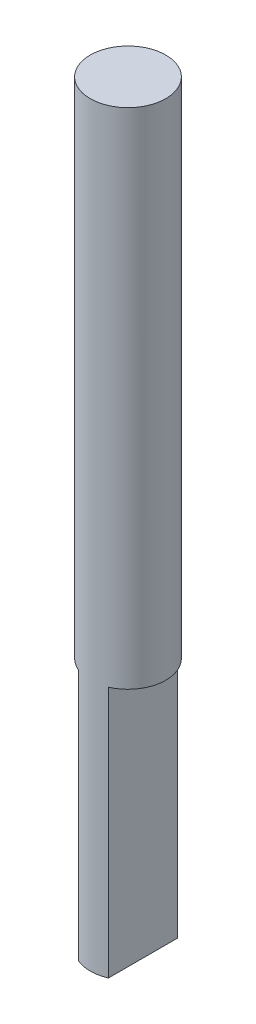
ISO-10303-21;
HEADER;
FILE_DESCRIPTION(('STEP AP214'),'2;1');
FILE_NAME('part.step','',(''),(''),'','','');
FILE_SCHEMA(('AUTOMOTIVE_DESIGN { 1 0 10303 214 1 1 1 1 }'));
ENDSEC;
DATA;
#1=APPLICATION_CONTEXT('core data for automotive mechanical design processes');
#2=APPLICATION_PROTOCOL_DEFINITION('international standard','automotive_design',2000,#1);
#3=PRODUCT_CONTEXT('',#1,'mechanical');
#4=PRODUCT('Part','Part','',(#3));
#5=PRODUCT_RELATED_PRODUCT_CATEGORY('part','',(#4));
#6=PRODUCT_DEFINITION_FORMATION('','',#4);
#7=PRODUCT_DEFINITION_CONTEXT('part definition',#1,'design');
#8=PRODUCT_DEFINITION('design','',#6,#7);
#9=PRODUCT_DEFINITION_SHAPE('','',#8);
#10=(LENGTH_UNIT() NAMED_UNIT(*) SI_UNIT(.MILLI.,.METRE.));
#11=(NAMED_UNIT(*) PLANE_ANGLE_UNIT() SI_UNIT($,.RADIAN.));
#12=(NAMED_UNIT(*) SI_UNIT($,.STERADIAN.) SOLID_ANGLE_UNIT());
#13=UNCERTAINTY_MEASURE_WITH_UNIT(LENGTH_MEASURE(1.E-05),#10,'distance_accuracy_value','');
#14=(GEOMETRIC_REPRESENTATION_CONTEXT(3) GLOBAL_UNCERTAINTY_ASSIGNED_CONTEXT((#13)) GLOBAL_UNIT_ASSIGNED_CONTEXT((#10,
#11,#12)) REPRESENTATION_CONTEXT('',''));
#15=CARTESIAN_POINT('',(0.,0.,0.));
#16=DIRECTION('',(0.,0.,1.));
#17=DIRECTION('',(1.,0.,0.));
#18=AXIS2_PLACEMENT_3D('',#15,#16,#17);
#19=CARTESIAN_POINT('',(0.,15.,0.));
#20=DIRECTION('',(0.,-1.,0.));
#21=DIRECTION('',(0.,0.,-1.));
#22=AXIS2_PLACEMENT_3D('',#19,#20,#21);
#23=CYLINDRICAL_SURFACE('',#22,0.75);
#24=CARTESIAN_POINT('',(0.,15.,0.));
#25=DIRECTION('',(0.,1.,0.));
#26=DIRECTION('',(0.,0.,1.));
#27=AXIS2_PLACEMENT_3D('',#24,#25,#26);
#28=CIRCLE('',#27,0.75);
#29=CARTESIAN_POINT('',(0.,15.,0.75));
#30=VERTEX_POINT('',#29);
#31=EDGE_CURVE('E11',#30,#30,#28,.T.);
#32=ORIENTED_EDGE('',*,*,#31,.F.);
#33=EDGE_LOOP('',(#32));
#34=FACE_BOUND('',#33,.T.);
#35=CARTESIAN_POINT('',(0.,5.,0.));
#36=DIRECTION('',(0.,-1.,0.));
#37=DIRECTION('',(0.,0.,-1.));
#38=AXIS2_PLACEMENT_3D('',#35,#36,#37);
#39=CIRCLE('',#38,0.75);
#40=CARTESIAN_POINT('',(-0.3,5.,0.687386354243376));
#41=VERTEX_POINT('',#40);
#42=CARTESIAN_POINT('',(-0.3,5.,-0.687386354243376));
#43=VERTEX_POINT('',#42);
#44=EDGE_CURVE('E84',#41,#43,#39,.T.);
#45=ORIENTED_EDGE('',*,*,#44,.F.);
#46=DIRECTION('',(0.,-1.,0.));
#47=VECTOR('',#46,1.);
#48=CARTESIAN_POINT('',(-0.3,5.,0.687386354243376));
#49=LINE('',#48,#47);
#50=CARTESIAN_POINT('',(-0.3,0.,0.687386354243376));
#51=VERTEX_POINT('',#50);
#52=EDGE_CURVE('E92',#41,#51,#49,.T.);
#53=ORIENTED_EDGE('',*,*,#52,.T.);
#54=CARTESIAN_POINT('',(0.,0.,0.));
#55=DIRECTION('',(0.,1.,0.));
#56=DIRECTION('',(0.,0.,1.));
#57=AXIS2_PLACEMENT_3D('',#54,#55,#56);
#58=CIRCLE('',#57,0.75);
#59=CARTESIAN_POINT('',(0.3,0.,0.687386354243376));
#60=VERTEX_POINT('',#59);
#61=EDGE_CURVE('E44',#51,#60,#58,.T.);
#62=ORIENTED_EDGE('',*,*,#61,.T.);
#63=DIRECTION('',(0.,-1.,0.));
#64=VECTOR('',#63,1.);
#65=CARTESIAN_POINT('',(0.3,5.,0.687386354243376));
#66=LINE('',#65,#64);
#67=CARTESIAN_POINT('',(0.3,5.,0.687386354243376));
#68=VERTEX_POINT('',#67);
#69=EDGE_CURVE('E64',#68,#60,#66,.T.);
#70=ORIENTED_EDGE('',*,*,#69,.F.);
#71=CARTESIAN_POINT('',(0.,5.,0.));
#72=DIRECTION('',(0.,-1.,0.));
#73=DIRECTION('',(0.,0.,-1.));
#74=AXIS2_PLACEMENT_3D('',#71,#72,#73);
#75=CIRCLE('',#74,0.75);
#76=CARTESIAN_POINT('',(0.3,5.,-0.687386354243376));
#77=VERTEX_POINT('',#76);
#78=EDGE_CURVE('E101',#77,#68,#75,.T.);
#79=ORIENTED_EDGE('',*,*,#78,.F.);
#80=DIRECTION('',(0.,-1.,0.));
#81=VECTOR('',#80,1.);
#82=CARTESIAN_POINT('',(0.3,5.,-0.687386354243376));
#83=LINE('',#82,#81);
#84=CARTESIAN_POINT('',(0.3,0.,-0.687386354243376));
#85=VERTEX_POINT('',#84);
#86=EDGE_CURVE('E108',#77,#85,#83,.T.);
#87=ORIENTED_EDGE('',*,*,#86,.T.);
#88=CARTESIAN_POINT('',(-0.3,0.,-0.687386354243376));
#89=VERTEX_POINT('',#88);
#90=EDGE_CURVE('E49',#85,#89,#58,.T.);
#91=ORIENTED_EDGE('',*,*,#90,.T.);
#92=DIRECTION('',(0.,-1.,0.));
#93=VECTOR('',#92,1.);
#94=CARTESIAN_POINT('',(-0.3,5.,-0.687386354243376));
#95=LINE('',#94,#93);
#96=EDGE_CURVE('E56',#43,#89,#95,.T.);
#97=ORIENTED_EDGE('',*,*,#96,.F.);
#98=EDGE_LOOP('',(#45,#53,#62,#70,#79,#87,#91,#97));
#99=FACE_BOUND('',#98,.T.);
#100=ADVANCED_FACE('F41',(#34,#99),#23,.T.);
#101=CARTESIAN_POINT('',(0.,15.,0.));
#102=DIRECTION('',(0.,1.,0.));
#103=DIRECTION('',(0.,0.,1.));
#104=AXIS2_PLACEMENT_3D('',#101,#102,#103);
#105=PLANE('',#104);
#106=ORIENTED_EDGE('',*,*,#31,.T.);
#107=EDGE_LOOP('',(#106));
#108=FACE_BOUND('',#107,.T.);
#109=ADVANCED_FACE('F127',(#108),#105,.T.);
#110=CARTESIAN_POINT('',(0.,0.,0.));
#111=DIRECTION('',(0.,1.,0.));
#112=DIRECTION('',(0.,0.,1.));
#113=AXIS2_PLACEMENT_3D('',#110,#111,#112);
#114=PLANE('',#113);
#115=ORIENTED_EDGE('',*,*,#61,.F.);
#116=DIRECTION('',(0.,0.,1.));
#117=VECTOR('',#116,1.);
#118=CARTESIAN_POINT('',(-0.3,0.,0.687386354243376));
#119=LINE('',#118,#117);
#120=EDGE_CURVE('E89',#89,#51,#119,.T.);
#121=ORIENTED_EDGE('',*,*,#120,.F.);
#122=ORIENTED_EDGE('',*,*,#90,.F.);
#123=DIRECTION('',(0.,0.,-1.));
#124=VECTOR('',#123,1.);
#125=CARTESIAN_POINT('',(0.3,0.,0.687386354243376));
#126=LINE('',#125,#124);
#127=EDGE_CURVE('E104',#60,#85,#126,.T.);
#128=ORIENTED_EDGE('',*,*,#127,.F.);
#129=EDGE_LOOP('',(#115,#121,#122,#128));
#130=FACE_BOUND('',#129,.T.);
#131=ADVANCED_FACE('F114',(#130),#114,.F.);
#132=CARTESIAN_POINT('',(0.3,5.,0.687386354243376));
#133=DIRECTION('',(-1.,0.,0.));
#134=DIRECTION('',(0.,0.,1.));
#135=AXIS2_PLACEMENT_3D('',#132,#133,#134);
#136=PLANE('',#135);
#137=ORIENTED_EDGE('',*,*,#127,.T.);
#138=ORIENTED_EDGE('',*,*,#86,.F.);
#139=DIRECTION('',(0.,0.,-1.));
#140=VECTOR('',#139,1.);
#141=CARTESIAN_POINT('',(0.3,5.,0.687386354243376));
#142=LINE('',#141,#140);
#143=EDGE_CURVE('E103',#68,#77,#142,.T.);
#144=ORIENTED_EDGE('',*,*,#143,.F.);
#145=ORIENTED_EDGE('',*,*,#69,.T.);
#146=EDGE_LOOP('',(#137,#138,#144,#145));
#147=FACE_BOUND('',#146,.T.);
#148=ADVANCED_FACE('F115',(#147),#136,.F.);
#149=CARTESIAN_POINT('',(0.,5.,0.));
#150=DIRECTION('',(0.,-1.,0.));
#151=DIRECTION('',(0.,0.,-1.));
#152=AXIS2_PLACEMENT_3D('',#149,#150,#151);
#153=PLANE('',#152);
#154=ORIENTED_EDGE('',*,*,#78,.T.);
#155=ORIENTED_EDGE('',*,*,#143,.T.);
#156=EDGE_LOOP('',(#154,#155));
#157=FACE_BOUND('',#156,.T.);
#158=ADVANCED_FACE('F117',(#157),#153,.T.);
#159=CARTESIAN_POINT('',(-0.3,5.,0.687386354243376));
#160=DIRECTION('',(1.,0.,0.));
#161=DIRECTION('',(0.,0.,-1.));
#162=AXIS2_PLACEMENT_3D('',#159,#160,#161);
#163=PLANE('',#162);
#164=ORIENTED_EDGE('',*,*,#120,.T.);
#165=ORIENTED_EDGE('',*,*,#52,.F.);
#166=DIRECTION('',(0.,0.,1.));
#167=VECTOR('',#166,1.);
#168=CARTESIAN_POINT('',(-0.3,5.,0.687386354243376));
#169=LINE('',#168,#167);
#170=EDGE_CURVE('E86',#43,#41,#169,.T.);
#171=ORIENTED_EDGE('',*,*,#170,.F.);
#172=ORIENTED_EDGE('',*,*,#96,.T.);
#173=EDGE_LOOP('',(#164,#165,#171,#172));
#174=FACE_BOUND('',#173,.T.);
#175=ADVANCED_FACE('F91',(#174),#163,.F.);
#176=CARTESIAN_POINT('',(0.,5.,0.));
#177=DIRECTION('',(0.,-1.,0.));
#178=DIRECTION('',(0.,0.,-1.));
#179=AXIS2_PLACEMENT_3D('',#176,#177,#178);
#180=PLANE('',#179);
#181=ORIENTED_EDGE('',*,*,#44,.T.);
#182=ORIENTED_EDGE('',*,*,#170,.T.);
#183=EDGE_LOOP('',(#181,#182));
#184=FACE_BOUND('',#183,.T.);
#185=ADVANCED_FACE('F85',(#184),#180,.T.);
#186=CLOSED_SHELL('',(#100,#109,#131,#148,#158,#175,#185));
#187=MANIFOLD_SOLID_BREP('B2',#186);
#188=ADVANCED_BREP_SHAPE_REPRESENTATION('',(#18,#187),#14);
#189=SHAPE_DEFINITION_REPRESENTATION(#9,#188);
ENDSEC;
END-ISO-10303-21;
